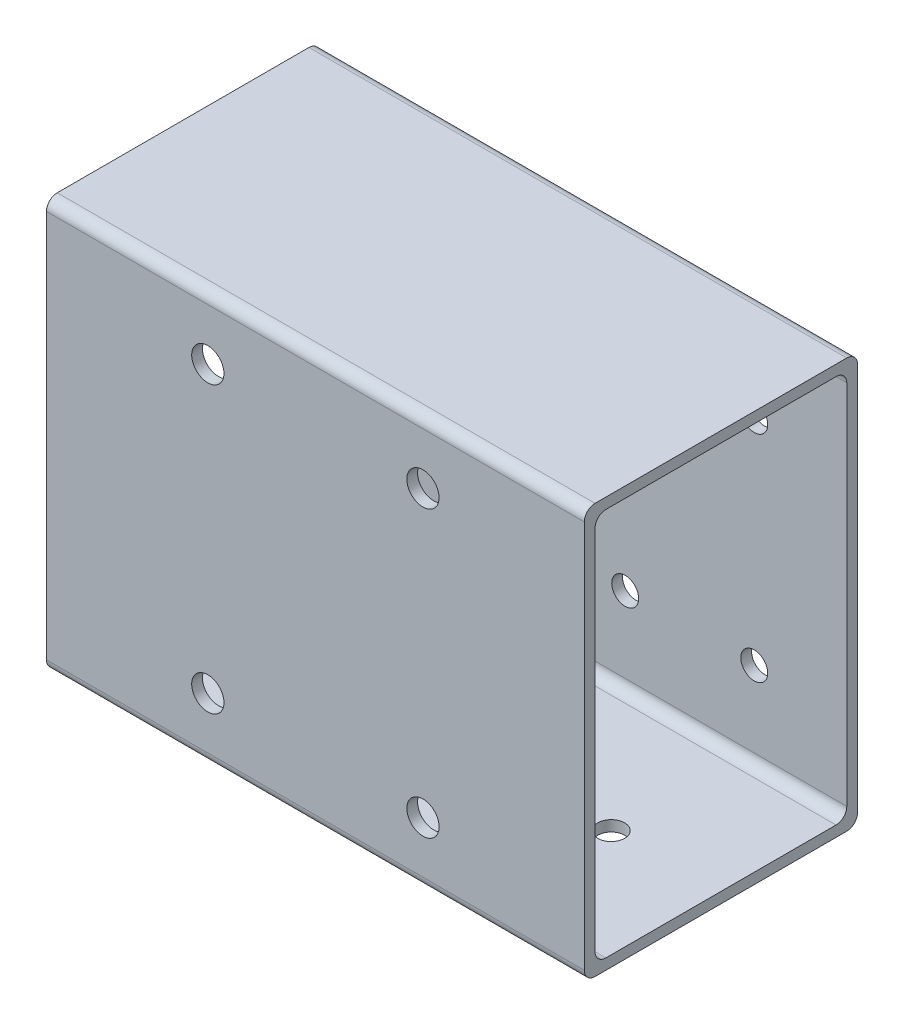
ISO-10303-21;
HEADER;
FILE_DESCRIPTION(('STEP AP214'),'2;1');
FILE_NAME('part.step','',(''),(''),'','','');
FILE_SCHEMA(('AUTOMOTIVE_DESIGN { 1 0 10303 214 1 1 1 1 }'));
ENDSEC;
DATA;
#1=APPLICATION_CONTEXT('core data for automotive mechanical design processes');
#2=APPLICATION_PROTOCOL_DEFINITION('international standard','automotive_design',2000,#1);
#3=PRODUCT_CONTEXT('',#1,'mechanical');
#4=PRODUCT('Part','Part','',(#3));
#5=PRODUCT_RELATED_PRODUCT_CATEGORY('part','',(#4));
#6=PRODUCT_DEFINITION_FORMATION('','',#4);
#7=PRODUCT_DEFINITION_CONTEXT('part definition',#1,'design');
#8=PRODUCT_DEFINITION('design','',#6,#7);
#9=PRODUCT_DEFINITION_SHAPE('','',#8);
#10=(LENGTH_UNIT() NAMED_UNIT(*) SI_UNIT(.MILLI.,.METRE.));
#11=(NAMED_UNIT(*) PLANE_ANGLE_UNIT() SI_UNIT($,.RADIAN.));
#12=(NAMED_UNIT(*) SI_UNIT($,.STERADIAN.) SOLID_ANGLE_UNIT());
#13=UNCERTAINTY_MEASURE_WITH_UNIT(LENGTH_MEASURE(1.E-05),#10,'distance_accuracy_value','');
#14=(GEOMETRIC_REPRESENTATION_CONTEXT(3) GLOBAL_UNCERTAINTY_ASSIGNED_CONTEXT((#13)) GLOBAL_UNIT_ASSIGNED_CONTEXT((#10,
#11,#12)) REPRESENTATION_CONTEXT('',''));
#15=CARTESIAN_POINT('',(0.,0.,0.));
#16=DIRECTION('',(0.,0.,1.));
#17=DIRECTION('',(1.,0.,0.));
#18=AXIS2_PLACEMENT_3D('',#15,#16,#17);
#19=CARTESIAN_POINT('',(-100.,38.1,25.4));
#20=DIRECTION('',(0.,0.,1.));
#21=DIRECTION('',(0.,-1.,0.));
#22=AXIS2_PLACEMENT_3D('',#19,#20,#21);
#23=PLANE('',#22);
#24=CARTESIAN_POINT('',(-30.,-26.5,25.4));
#25=DIRECTION('',(0.,0.,1.));
#26=DIRECTION('',(1.,0.,0.));
#27=AXIS2_PLACEMENT_3D('',#24,#25,#26);
#28=CIRCLE('',#27,3.);
#29=CARTESIAN_POINT('',(-27.,-26.5,25.4));
#30=VERTEX_POINT('',#29);
#31=EDGE_CURVE('E324',#30,#30,#28,.T.);
#32=ORIENTED_EDGE('',*,*,#31,.F.);
#33=EDGE_LOOP('',(#32));
#34=FACE_BOUND('',#33,.T.);
#35=CARTESIAN_POINT('',(-70.,-26.5,25.4));
#36=DIRECTION('',(0.,0.,1.));
#37=DIRECTION('',(1.,0.,0.));
#38=AXIS2_PLACEMENT_3D('',#35,#36,#37);
#39=CIRCLE('',#38,3.00000000000001);
#40=CARTESIAN_POINT('',(-67.,-26.5,25.4));
#41=VERTEX_POINT('',#40);
#42=EDGE_CURVE('E397',#41,#41,#39,.T.);
#43=ORIENTED_EDGE('',*,*,#42,.F.);
#44=EDGE_LOOP('',(#43));
#45=FACE_BOUND('',#44,.T.);
#46=CARTESIAN_POINT('',(-70.,26.5,25.4));
#47=DIRECTION('',(0.,0.,1.));
#48=DIRECTION('',(1.,0.,0.));
#49=AXIS2_PLACEMENT_3D('',#46,#47,#48);
#50=CIRCLE('',#49,3.00000000000001);
#51=CARTESIAN_POINT('',(-67.,26.5,25.4));
#52=VERTEX_POINT('',#51);
#53=EDGE_CURVE('E393',#52,#52,#50,.T.);
#54=ORIENTED_EDGE('',*,*,#53,.F.);
#55=EDGE_LOOP('',(#54));
#56=FACE_BOUND('',#55,.T.);
#57=CARTESIAN_POINT('',(-30.,26.5,25.4));
#58=DIRECTION('',(0.,0.,1.));
#59=DIRECTION('',(1.,0.,0.));
#60=AXIS2_PLACEMENT_3D('',#57,#58,#59);
#61=CIRCLE('',#60,3.);
#62=CARTESIAN_POINT('',(-27.,26.5,25.4));
#63=VERTEX_POINT('',#62);
#64=EDGE_CURVE('E290',#63,#63,#61,.T.);
#65=ORIENTED_EDGE('',*,*,#64,.F.);
#66=EDGE_LOOP('',(#65));
#67=FACE_BOUND('',#66,.T.);
#68=DIRECTION('',(0.,-1.,0.));
#69=VECTOR('',#68,1.);
#70=CARTESIAN_POINT('',(-100.,38.1,25.4));
#71=LINE('',#70,#69);
#72=CARTESIAN_POINT('',(-100.,36.1,25.4));
#73=VERTEX_POINT('',#72);
#74=CARTESIAN_POINT('',(-100.,-36.0999999999999,25.4));
#75=VERTEX_POINT('',#74);
#76=EDGE_CURVE('E438',#73,#75,#71,.T.);
#77=ORIENTED_EDGE('',*,*,#76,.T.);
#78=DIRECTION('',(1.,0.,0.));
#79=VECTOR('',#78,1.);
#80=CARTESIAN_POINT('',(-100.,-36.1,25.4));
#81=LINE('',#80,#79);
#82=CARTESIAN_POINT('',(0.,-36.0999999999999,25.4));
#83=VERTEX_POINT('',#82);
#84=EDGE_CURVE('E228',#75,#83,#81,.T.);
#85=ORIENTED_EDGE('',*,*,#84,.T.);
#86=DIRECTION('',(0.,-1.,0.));
#87=VECTOR('',#86,1.);
#88=CARTESIAN_POINT('',(0.,38.1,25.4));
#89=LINE('',#88,#87);
#90=CARTESIAN_POINT('',(0.,36.1,25.4));
#91=VERTEX_POINT('',#90);
#92=EDGE_CURVE('E166',#91,#83,#89,.T.);
#93=ORIENTED_EDGE('',*,*,#92,.F.);
#94=DIRECTION('',(1.,0.,0.));
#95=VECTOR('',#94,1.);
#96=CARTESIAN_POINT('',(-100.,36.1,25.4));
#97=LINE('',#96,#95);
#98=EDGE_CURVE('E225',#91,#73,#97,.F.);
#99=ORIENTED_EDGE('',*,*,#98,.T.);
#100=EDGE_LOOP('',(#77,#85,#93,#99));
#101=FACE_BOUND('',#100,.T.);
#102=ADVANCED_FACE('F44',(#34,#45,#56,#67,#101),#23,.T.);
#103=CARTESIAN_POINT('',(-100.,38.1,-25.4));
#104=DIRECTION('',(0.,1.,0.));
#105=DIRECTION('',(0.,0.,1.));
#106=AXIS2_PLACEMENT_3D('',#103,#104,#105);
#107=PLANE('',#106);
#108=DIRECTION('',(0.,0.,1.));
#109=VECTOR('',#108,1.);
#110=CARTESIAN_POINT('',(-100.,38.1,-25.4));
#111=LINE('',#110,#109);
#112=CARTESIAN_POINT('',(-100.,38.1,-23.4));
#113=VERTEX_POINT('',#112);
#114=CARTESIAN_POINT('',(-100.,38.1,23.4));
#115=VERTEX_POINT('',#114);
#116=EDGE_CURVE('E190',#113,#115,#111,.T.);
#117=ORIENTED_EDGE('',*,*,#116,.T.);
#118=DIRECTION('',(1.,0.,0.));
#119=VECTOR('',#118,1.);
#120=CARTESIAN_POINT('',(-100.,38.1,23.4));
#121=LINE('',#120,#119);
#122=CARTESIAN_POINT('',(0.,38.1,23.4));
#123=VERTEX_POINT('',#122);
#124=EDGE_CURVE('E233',#115,#123,#121,.T.);
#125=ORIENTED_EDGE('',*,*,#124,.T.);
#126=DIRECTION('',(0.,0.,1.));
#127=VECTOR('',#126,1.);
#128=CARTESIAN_POINT('',(0.,38.1,-25.4));
#129=LINE('',#128,#127);
#130=CARTESIAN_POINT('',(0.,38.1,-23.4));
#131=VERTEX_POINT('',#130);
#132=EDGE_CURVE('E199',#131,#123,#129,.T.);
#133=ORIENTED_EDGE('',*,*,#132,.F.);
#134=DIRECTION('',(1.,0.,0.));
#135=VECTOR('',#134,1.);
#136=CARTESIAN_POINT('',(-100.,38.1,-23.4));
#137=LINE('',#136,#135);
#138=EDGE_CURVE('E69',#131,#113,#137,.F.);
#139=ORIENTED_EDGE('',*,*,#138,.T.);
#140=EDGE_LOOP('',(#117,#125,#133,#139));
#141=FACE_BOUND('',#140,.T.);
#142=ADVANCED_FACE('F454',(#141),#107,.T.);
#143=CARTESIAN_POINT('',(-100.,38.1,-25.4));
#144=DIRECTION('',(0.,0.,-1.));
#145=DIRECTION('',(0.,1.,0.));
#146=AXIS2_PLACEMENT_3D('',#143,#144,#145);
#147=PLANE('',#146);
#148=CARTESIAN_POINT('',(-17.2,-20.,-25.4));
#149=DIRECTION('',(0.,0.,-1.));
#150=DIRECTION('',(0.,1.,0.));
#151=AXIS2_PLACEMENT_3D('',#148,#149,#150);
#152=CIRCLE('',#151,2.5);
#153=CARTESIAN_POINT('',(-17.2,-17.5,-25.4));
#154=VERTEX_POINT('',#153);
#155=EDGE_CURVE('E351',#154,#154,#152,.T.);
#156=ORIENTED_EDGE('',*,*,#155,.F.);
#157=EDGE_LOOP('',(#156));
#158=FACE_BOUND('',#157,.T.);
#159=CARTESIAN_POINT('',(-41.2,-20.,-25.4));
#160=DIRECTION('',(0.,0.,-1.));
#161=DIRECTION('',(0.,1.,0.));
#162=AXIS2_PLACEMENT_3D('',#159,#160,#161);
#163=CIRCLE('',#162,2.5);
#164=CARTESIAN_POINT('',(-41.2,-17.5,-25.4));
#165=VERTEX_POINT('',#164);
#166=EDGE_CURVE('E365',#165,#165,#163,.T.);
#167=ORIENTED_EDGE('',*,*,#166,.F.);
#168=EDGE_LOOP('',(#167));
#169=FACE_BOUND('',#168,.T.);
#170=CARTESIAN_POINT('',(-41.2,20.,-25.4));
#171=DIRECTION('',(0.,0.,-1.));
#172=DIRECTION('',(0.,1.,0.));
#173=AXIS2_PLACEMENT_3D('',#170,#171,#172);
#174=CIRCLE('',#173,2.5);
#175=CARTESIAN_POINT('',(-41.2,22.5,-25.4));
#176=VERTEX_POINT('',#175);
#177=EDGE_CURVE('E361',#176,#176,#174,.T.);
#178=ORIENTED_EDGE('',*,*,#177,.F.);
#179=EDGE_LOOP('',(#178));
#180=FACE_BOUND('',#179,.T.);
#181=CARTESIAN_POINT('',(-17.2,20.,-25.4));
#182=DIRECTION('',(0.,0.,-1.));
#183=DIRECTION('',(0.,1.,0.));
#184=AXIS2_PLACEMENT_3D('',#181,#182,#183);
#185=CIRCLE('',#184,2.5);
#186=CARTESIAN_POINT('',(-17.2,22.5,-25.4));
#187=VERTEX_POINT('',#186);
#188=EDGE_CURVE('E330',#187,#187,#185,.T.);
#189=ORIENTED_EDGE('',*,*,#188,.F.);
#190=EDGE_LOOP('',(#189));
#191=FACE_BOUND('',#190,.T.);
#192=CARTESIAN_POINT('',(-74.6,0.,-25.4));
#193=DIRECTION('',(0.,0.,-1.));
#194=DIRECTION('',(0.,1.,0.));
#195=AXIS2_PLACEMENT_3D('',#192,#193,#194);
#196=CIRCLE('',#195,2.5);
#197=CARTESIAN_POINT('',(-74.6,2.49999999999999,-25.4));
#198=VERTEX_POINT('',#197);
#199=EDGE_CURVE('E341',#198,#198,#196,.T.);
#200=ORIENTED_EDGE('',*,*,#199,.F.);
#201=EDGE_LOOP('',(#200));
#202=FACE_BOUND('',#201,.T.);
#203=CARTESIAN_POINT('',(-90.,-23.1,-25.4));
#204=DIRECTION('',(0.,0.,-1.));
#205=DIRECTION('',(0.,1.,0.));
#206=AXIS2_PLACEMENT_3D('',#203,#204,#205);
#207=CIRCLE('',#206,2.50000000000001);
#208=CARTESIAN_POINT('',(-90.,-20.6,-25.4));
#209=VERTEX_POINT('',#208);
#210=EDGE_CURVE('E383',#209,#209,#207,.T.);
#211=ORIENTED_EDGE('',*,*,#210,.F.);
#212=EDGE_LOOP('',(#211));
#213=FACE_BOUND('',#212,.T.);
#214=CARTESIAN_POINT('',(-59.2,-23.1,-25.4));
#215=DIRECTION('',(0.,0.,-1.));
#216=DIRECTION('',(0.,1.,0.));
#217=AXIS2_PLACEMENT_3D('',#214,#215,#216);
#218=CIRCLE('',#217,2.5);
#219=CARTESIAN_POINT('',(-59.2,-20.6,-25.4));
#220=VERTEX_POINT('',#219);
#221=EDGE_CURVE('E379',#220,#220,#218,.T.);
#222=ORIENTED_EDGE('',*,*,#221,.F.);
#223=EDGE_LOOP('',(#222));
#224=FACE_BOUND('',#223,.T.);
#225=CARTESIAN_POINT('',(-59.2,23.1,-25.4));
#226=DIRECTION('',(0.,0.,-1.));
#227=DIRECTION('',(0.,1.,0.));
#228=AXIS2_PLACEMENT_3D('',#225,#226,#227);
#229=CIRCLE('',#228,2.5);
#230=CARTESIAN_POINT('',(-59.2,25.6,-25.4));
#231=VERTEX_POINT('',#230);
#232=EDGE_CURVE('E375',#231,#231,#229,.T.);
#233=ORIENTED_EDGE('',*,*,#232,.F.);
#234=EDGE_LOOP('',(#233));
#235=FACE_BOUND('',#234,.T.);
#236=CARTESIAN_POINT('',(-90.,23.1,-25.4));
#237=DIRECTION('',(0.,0.,-1.));
#238=DIRECTION('',(0.,1.,0.));
#239=AXIS2_PLACEMENT_3D('',#236,#237,#238);
#240=CIRCLE('',#239,2.5);
#241=CARTESIAN_POINT('',(-90.,25.6,-25.4));
#242=VERTEX_POINT('',#241);
#243=EDGE_CURVE('E308',#242,#242,#240,.T.);
#244=ORIENTED_EDGE('',*,*,#243,.F.);
#245=EDGE_LOOP('',(#244));
#246=FACE_BOUND('',#245,.T.);
#247=DIRECTION('',(0.,1.,0.));
#248=VECTOR('',#247,1.);
#249=CARTESIAN_POINT('',(0.,38.1,-25.4));
#250=LINE('',#249,#248);
#251=CARTESIAN_POINT('',(0.,-36.0999999999999,-25.4));
#252=VERTEX_POINT('',#251);
#253=CARTESIAN_POINT('',(0.,36.1,-25.4));
#254=VERTEX_POINT('',#253);
#255=EDGE_CURVE('E184',#252,#254,#250,.T.);
#256=ORIENTED_EDGE('',*,*,#255,.F.);
#257=DIRECTION('',(1.,0.,0.));
#258=VECTOR('',#257,1.);
#259=CARTESIAN_POINT('',(-100.,-36.1,-25.4));
#260=LINE('',#259,#258);
#261=CARTESIAN_POINT('',(-100.,-36.0999999999999,-25.4));
#262=VERTEX_POINT('',#261);
#263=EDGE_CURVE('E212',#252,#262,#260,.F.);
#264=ORIENTED_EDGE('',*,*,#263,.T.);
#265=DIRECTION('',(0.,1.,0.));
#266=VECTOR('',#265,1.);
#267=CARTESIAN_POINT('',(-100.,38.1,-25.4));
#268=LINE('',#267,#266);
#269=CARTESIAN_POINT('',(-100.,36.1,-25.4));
#270=VERTEX_POINT('',#269);
#271=EDGE_CURVE('E196',#262,#270,#268,.T.);
#272=ORIENTED_EDGE('',*,*,#271,.T.);
#273=DIRECTION('',(1.,0.,0.));
#274=VECTOR('',#273,1.);
#275=CARTESIAN_POINT('',(-100.,36.1,-25.4));
#276=LINE('',#275,#274);
#277=EDGE_CURVE('E208',#270,#254,#276,.T.);
#278=ORIENTED_EDGE('',*,*,#277,.T.);
#279=EDGE_LOOP('',(#256,#264,#272,#278));
#280=FACE_BOUND('',#279,.T.);
#281=ADVANCED_FACE('F464',(#158,#169,#180,#191,#202,#213,#224,#235,#246,#280),#147,.T.);
#282=CARTESIAN_POINT('',(-100.,-38.1,-25.4));
#283=DIRECTION('',(0.,-1.,0.));
#284=DIRECTION('',(0.,0.,-1.));
#285=AXIS2_PLACEMENT_3D('',#282,#283,#284);
#286=PLANE('',#285);
#287=CARTESIAN_POINT('',(-20.,-38.1,0.399999999999993));
#288=DIRECTION('',(0.,-1.,0.));
#289=DIRECTION('',(0.,0.,-1.));
#290=AXIS2_PLACEMENT_3D('',#287,#288,#289);
#291=CIRCLE('',#290,2.5);
#292=CARTESIAN_POINT('',(-20.,-38.1,-2.10000000000001));
#293=VERTEX_POINT('',#292);
#294=EDGE_CURVE('E345',#293,#293,#291,.T.);
#295=ORIENTED_EDGE('',*,*,#294,.F.);
#296=EDGE_LOOP('',(#295));
#297=FACE_BOUND('',#296,.T.);
#298=CARTESIAN_POINT('',(-80.,-38.1,0.399999999999986));
#299=DIRECTION('',(0.,-1.,0.));
#300=DIRECTION('',(0.,0.,-1.));
#301=AXIS2_PLACEMENT_3D('',#298,#299,#300);
#302=CIRCLE('',#301,2.50000000000001);
#303=CARTESIAN_POINT('',(-80.,-38.1,-2.10000000000002));
#304=VERTEX_POINT('',#303);
#305=EDGE_CURVE('E353',#304,#304,#302,.T.);
#306=ORIENTED_EDGE('',*,*,#305,.F.);
#307=EDGE_LOOP('',(#306));
#308=FACE_BOUND('',#307,.T.);
#309=DIRECTION('',(0.,0.,-1.));
#310=VECTOR('',#309,1.);
#311=CARTESIAN_POINT('',(-100.,-38.1,-25.4));
#312=LINE('',#311,#310);
#313=CARTESIAN_POINT('',(-100.,-38.1,23.4));
#314=VERTEX_POINT('',#313);
#315=CARTESIAN_POINT('',(-100.,-38.1,-23.4));
#316=VERTEX_POINT('',#315);
#317=EDGE_CURVE('E442',#314,#316,#312,.T.);
#318=ORIENTED_EDGE('',*,*,#317,.T.);
#319=DIRECTION('',(1.,0.,0.));
#320=VECTOR('',#319,1.);
#321=CARTESIAN_POINT('',(-100.,-38.1,-23.4));
#322=LINE('',#321,#320);
#323=CARTESIAN_POINT('',(0.,-38.1,-23.4));
#324=VERTEX_POINT('',#323);
#325=EDGE_CURVE('E182',#316,#324,#322,.T.);
#326=ORIENTED_EDGE('',*,*,#325,.T.);
#327=DIRECTION('',(0.,0.,-1.));
#328=VECTOR('',#327,1.);
#329=CARTESIAN_POINT('',(0.,-38.1,-25.4));
#330=LINE('',#329,#328);
#331=CARTESIAN_POINT('',(0.,-38.1,23.4));
#332=VERTEX_POINT('',#331);
#333=EDGE_CURVE('E164',#332,#324,#330,.T.);
#334=ORIENTED_EDGE('',*,*,#333,.F.);
#335=DIRECTION('',(1.,0.,0.));
#336=VECTOR('',#335,1.);
#337=CARTESIAN_POINT('',(-100.,-38.1,23.4));
#338=LINE('',#337,#336);
#339=EDGE_CURVE('E179',#332,#314,#338,.F.);
#340=ORIENTED_EDGE('',*,*,#339,.T.);
#341=EDGE_LOOP('',(#318,#326,#334,#340));
#342=FACE_BOUND('',#341,.T.);
#343=ADVANCED_FACE('F178',(#297,#308,#342),#286,.T.);
#344=CARTESIAN_POINT('',(-100.,0.,0.));
#345=DIRECTION('',(-1.,0.,0.));
#346=DIRECTION('',(0.,0.,1.));
#347=AXIS2_PLACEMENT_3D('',#344,#345,#346);
#348=PLANE('',#347);
#349=DIRECTION('',(0.,0.,1.));
#350=VECTOR('',#349,1.);
#351=CARTESIAN_POINT('',(-100.,36.1,-23.4));
#352=LINE('',#351,#350);
#353=CARTESIAN_POINT('',(-100.,36.1,-21.4));
#354=VERTEX_POINT('',#353);
#355=CARTESIAN_POINT('',(-100.,36.1,21.4));
#356=VERTEX_POINT('',#355);
#357=EDGE_CURVE('E420',#354,#356,#352,.T.);
#358=ORIENTED_EDGE('',*,*,#357,.T.);
#359=CARTESIAN_POINT('',(-100.,34.1,21.4));
#360=DIRECTION('',(-1.,0.,0.));
#361=DIRECTION('',(0.,0.,1.));
#362=AXIS2_PLACEMENT_3D('',#359,#360,#361);
#363=CIRCLE('',#362,2.);
#364=CARTESIAN_POINT('',(-100.,34.1,23.4));
#365=VERTEX_POINT('',#364);
#366=EDGE_CURVE('E11',#356,#365,#363,.F.);
#367=ORIENTED_EDGE('',*,*,#366,.T.);
#368=DIRECTION('',(0.,-1.,0.));
#369=VECTOR('',#368,1.);
#370=CARTESIAN_POINT('',(-100.,36.1,23.4));
#371=LINE('',#370,#369);
#372=CARTESIAN_POINT('',(-100.,-34.1,23.4));
#373=VERTEX_POINT('',#372);
#374=EDGE_CURVE('E407',#365,#373,#371,.T.);
#375=ORIENTED_EDGE('',*,*,#374,.T.);
#376=CARTESIAN_POINT('',(-100.,-34.1,21.4));
#377=DIRECTION('',(-1.,0.,0.));
#378=DIRECTION('',(0.,0.,1.));
#379=AXIS2_PLACEMENT_3D('',#376,#377,#378);
#380=CIRCLE('',#379,2.);
#381=CARTESIAN_POINT('',(-100.,-36.1,21.4));
#382=VERTEX_POINT('',#381);
#383=EDGE_CURVE('E280',#373,#382,#380,.F.);
#384=ORIENTED_EDGE('',*,*,#383,.T.);
#385=DIRECTION('',(0.,0.,-1.));
#386=VECTOR('',#385,1.);
#387=CARTESIAN_POINT('',(-100.,-36.1,-23.4));
#388=LINE('',#387,#386);
#389=CARTESIAN_POINT('',(-100.,-36.1,-21.4));
#390=VERTEX_POINT('',#389);
#391=EDGE_CURVE('E411',#382,#390,#388,.T.);
#392=ORIENTED_EDGE('',*,*,#391,.T.);
#393=CARTESIAN_POINT('',(-100.,-34.1,-21.4));
#394=DIRECTION('',(-1.,0.,0.));
#395=DIRECTION('',(0.,0.,1.));
#396=AXIS2_PLACEMENT_3D('',#393,#394,#395);
#397=CIRCLE('',#396,2.);
#398=CARTESIAN_POINT('',(-100.,-34.1,-23.4));
#399=VERTEX_POINT('',#398);
#400=EDGE_CURVE('E268',#390,#399,#397,.F.);
#401=ORIENTED_EDGE('',*,*,#400,.T.);
#402=DIRECTION('',(0.,1.,0.));
#403=VECTOR('',#402,1.);
#404=CARTESIAN_POINT('',(-100.,36.1,-23.4));
#405=LINE('',#404,#403);
#406=CARTESIAN_POINT('',(-100.,34.1,-23.4));
#407=VERTEX_POINT('',#406);
#408=EDGE_CURVE('E416',#399,#407,#405,.T.);
#409=ORIENTED_EDGE('',*,*,#408,.T.);
#410=CARTESIAN_POINT('',(-100.,34.1,-21.4));
#411=DIRECTION('',(-1.,0.,0.));
#412=DIRECTION('',(0.,0.,1.));
#413=AXIS2_PLACEMENT_3D('',#410,#411,#412);
#414=CIRCLE('',#413,2.);
#415=EDGE_CURVE('E274',#407,#354,#414,.F.);
#416=ORIENTED_EDGE('',*,*,#415,.T.);
#417=EDGE_LOOP('',(#358,#367,#375,#384,#392,#401,#409,#416));
#418=FACE_BOUND('',#417,.T.);
#419=ORIENTED_EDGE('',*,*,#271,.F.);
#420=CARTESIAN_POINT('',(-100.,-36.1,-23.4));
#421=DIRECTION('',(-1.,0.,0.));
#422=DIRECTION('',(0.,0.,1.));
#423=AXIS2_PLACEMENT_3D('',#420,#421,#422);
#424=CIRCLE('',#423,2.);
#425=EDGE_CURVE('E222',#262,#316,#424,.T.);
#426=ORIENTED_EDGE('',*,*,#425,.T.);
#427=ORIENTED_EDGE('',*,*,#317,.F.);
#428=CARTESIAN_POINT('',(-100.,-36.1,23.4));
#429=DIRECTION('',(-1.,0.,0.));
#430=DIRECTION('',(0.,0.,1.));
#431=AXIS2_PLACEMENT_3D('',#428,#429,#430);
#432=CIRCLE('',#431,2.);
#433=EDGE_CURVE('E188',#314,#75,#432,.T.);
#434=ORIENTED_EDGE('',*,*,#433,.T.);
#435=ORIENTED_EDGE('',*,*,#76,.F.);
#436=CARTESIAN_POINT('',(-100.,36.1,23.4));
#437=DIRECTION('',(-1.,0.,0.));
#438=DIRECTION('',(0.,0.,1.));
#439=AXIS2_PLACEMENT_3D('',#436,#437,#438);
#440=CIRCLE('',#439,2.);
#441=EDGE_CURVE('E62',#73,#115,#440,.T.);
#442=ORIENTED_EDGE('',*,*,#441,.T.);
#443=ORIENTED_EDGE('',*,*,#116,.F.);
#444=CARTESIAN_POINT('',(-100.,36.1,-23.4));
#445=DIRECTION('',(-1.,0.,0.));
#446=DIRECTION('',(0.,0.,1.));
#447=AXIS2_PLACEMENT_3D('',#444,#445,#446);
#448=CIRCLE('',#447,2.);
#449=EDGE_CURVE('E215',#113,#270,#448,.T.);
#450=ORIENTED_EDGE('',*,*,#449,.T.);
#451=EDGE_LOOP('',(#419,#426,#427,#434,#435,#442,#443,#450));
#452=FACE_BOUND('',#451,.T.);
#453=ADVANCED_FACE('F461',(#418,#452),#348,.T.);
#454=CARTESIAN_POINT('',(0.,0.,0.));
#455=DIRECTION('',(-1.,0.,0.));
#456=DIRECTION('',(0.,0.,1.));
#457=AXIS2_PLACEMENT_3D('',#454,#455,#456);
#458=PLANE('',#457);
#459=DIRECTION('',(0.,0.,-1.));
#460=VECTOR('',#459,1.);
#461=CARTESIAN_POINT('',(0.,-36.1,-23.4));
#462=LINE('',#461,#460);
#463=CARTESIAN_POINT('',(0.,-36.1,21.4));
#464=VERTEX_POINT('',#463);
#465=CARTESIAN_POINT('',(0.,-36.1,-21.4));
#466=VERTEX_POINT('',#465);
#467=EDGE_CURVE('E427',#464,#466,#462,.T.);
#468=ORIENTED_EDGE('',*,*,#467,.F.);
#469=CARTESIAN_POINT('',(0.,-34.1,21.4));
#470=DIRECTION('',(-1.,0.,0.));
#471=DIRECTION('',(0.,0.,1.));
#472=AXIS2_PLACEMENT_3D('',#469,#470,#471);
#473=CIRCLE('',#472,2.);
#474=CARTESIAN_POINT('',(0.,-34.1,23.4));
#475=VERTEX_POINT('',#474);
#476=EDGE_CURVE('E277',#464,#475,#473,.T.);
#477=ORIENTED_EDGE('',*,*,#476,.T.);
#478=DIRECTION('',(0.,-1.,0.));
#479=VECTOR('',#478,1.);
#480=CARTESIAN_POINT('',(0.,36.1,23.4));
#481=LINE('',#480,#479);
#482=CARTESIAN_POINT('',(0.,34.1,23.4));
#483=VERTEX_POINT('',#482);
#484=EDGE_CURVE('E302',#483,#475,#481,.T.);
#485=ORIENTED_EDGE('',*,*,#484,.F.);
#486=CARTESIAN_POINT('',(0.,34.1,21.4));
#487=DIRECTION('',(-1.,0.,0.));
#488=DIRECTION('',(0.,0.,1.));
#489=AXIS2_PLACEMENT_3D('',#486,#487,#488);
#490=CIRCLE('',#489,2.);
#491=CARTESIAN_POINT('',(0.,36.1,21.4));
#492=VERTEX_POINT('',#491);
#493=EDGE_CURVE('E54',#483,#492,#490,.T.);
#494=ORIENTED_EDGE('',*,*,#493,.T.);
#495=DIRECTION('',(0.,0.,1.));
#496=VECTOR('',#495,1.);
#497=CARTESIAN_POINT('',(0.,36.1,-23.4));
#498=LINE('',#497,#496);
#499=CARTESIAN_POINT('',(0.,36.1,-21.4));
#500=VERTEX_POINT('',#499);
#501=EDGE_CURVE('E412',#500,#492,#498,.T.);
#502=ORIENTED_EDGE('',*,*,#501,.F.);
#503=CARTESIAN_POINT('',(0.,34.1,-21.4));
#504=DIRECTION('',(-1.,0.,0.));
#505=DIRECTION('',(0.,0.,1.));
#506=AXIS2_PLACEMENT_3D('',#503,#504,#505);
#507=CIRCLE('',#506,2.);
#508=CARTESIAN_POINT('',(0.,34.1,-23.4));
#509=VERTEX_POINT('',#508);
#510=EDGE_CURVE('E271',#500,#509,#507,.T.);
#511=ORIENTED_EDGE('',*,*,#510,.T.);
#512=DIRECTION('',(0.,1.,0.));
#513=VECTOR('',#512,1.);
#514=CARTESIAN_POINT('',(0.,36.1,-23.4));
#515=LINE('',#514,#513);
#516=CARTESIAN_POINT('',(0.,-34.1,-23.4));
#517=VERTEX_POINT('',#516);
#518=EDGE_CURVE('E431',#517,#509,#515,.T.);
#519=ORIENTED_EDGE('',*,*,#518,.F.);
#520=CARTESIAN_POINT('',(0.,-34.1,-21.4));
#521=DIRECTION('',(-1.,0.,0.));
#522=DIRECTION('',(0.,0.,1.));
#523=AXIS2_PLACEMENT_3D('',#520,#521,#522);
#524=CIRCLE('',#523,2.);
#525=EDGE_CURVE('E265',#517,#466,#524,.T.);
#526=ORIENTED_EDGE('',*,*,#525,.T.);
#527=EDGE_LOOP('',(#468,#477,#485,#494,#502,#511,#519,#526));
#528=FACE_BOUND('',#527,.T.);
#529=ORIENTED_EDGE('',*,*,#333,.T.);
#530=CARTESIAN_POINT('',(0.,-36.1,-23.4));
#531=DIRECTION('',(-1.,0.,0.));
#532=DIRECTION('',(0.,0.,1.));
#533=AXIS2_PLACEMENT_3D('',#530,#531,#532);
#534=CIRCLE('',#533,2.);
#535=EDGE_CURVE('E172',#324,#252,#534,.F.);
#536=ORIENTED_EDGE('',*,*,#535,.T.);
#537=ORIENTED_EDGE('',*,*,#255,.T.);
#538=CARTESIAN_POINT('',(0.,36.1,-23.4));
#539=DIRECTION('',(-1.,0.,0.));
#540=DIRECTION('',(0.,0.,1.));
#541=AXIS2_PLACEMENT_3D('',#538,#539,#540);
#542=CIRCLE('',#541,2.);
#543=EDGE_CURVE('E194',#254,#131,#542,.F.);
#544=ORIENTED_EDGE('',*,*,#543,.T.);
#545=ORIENTED_EDGE('',*,*,#132,.T.);
#546=CARTESIAN_POINT('',(0.,36.1,23.4));
#547=DIRECTION('',(-1.,0.,0.));
#548=DIRECTION('',(0.,0.,1.));
#549=AXIS2_PLACEMENT_3D('',#546,#547,#548);
#550=CIRCLE('',#549,2.);
#551=EDGE_CURVE('E173',#123,#91,#550,.F.);
#552=ORIENTED_EDGE('',*,*,#551,.T.);
#553=ORIENTED_EDGE('',*,*,#92,.T.);
#554=CARTESIAN_POINT('',(0.,-36.1,23.4));
#555=DIRECTION('',(-1.,0.,0.));
#556=DIRECTION('',(0.,0.,1.));
#557=AXIS2_PLACEMENT_3D('',#554,#555,#556);
#558=CIRCLE('',#557,2.);
#559=EDGE_CURVE('E161',#83,#332,#558,.F.);
#560=ORIENTED_EDGE('',*,*,#559,.T.);
#561=EDGE_LOOP('',(#529,#536,#537,#544,#545,#552,#553,#560));
#562=FACE_BOUND('',#561,.T.);
#563=ADVANCED_FACE('F163',(#528,#562),#458,.F.);
#564=CARTESIAN_POINT('',(-100.,36.1,23.4));
#565=DIRECTION('',(0.,0.,1.));
#566=DIRECTION('',(1.,0.,0.));
#567=AXIS2_PLACEMENT_3D('',#564,#565,#566);
#568=PLANE('',#567);
#569=CARTESIAN_POINT('',(-30.,-26.5,23.4));
#570=DIRECTION('',(0.,0.,1.));
#571=DIRECTION('',(1.,0.,0.));
#572=AXIS2_PLACEMENT_3D('',#569,#570,#571);
#573=CIRCLE('',#572,3.);
#574=CARTESIAN_POINT('',(-27.,-26.5,23.4));
#575=VERTEX_POINT('',#574);
#576=EDGE_CURVE('E298',#575,#575,#573,.T.);
#577=ORIENTED_EDGE('',*,*,#576,.T.);
#578=EDGE_LOOP('',(#577));
#579=FACE_BOUND('',#578,.T.);
#580=CARTESIAN_POINT('',(-70.,-26.5,23.4));
#581=DIRECTION('',(0.,0.,1.));
#582=DIRECTION('',(1.,0.,0.));
#583=AXIS2_PLACEMENT_3D('',#580,#581,#582);
#584=CIRCLE('',#583,3.00000000000001);
#585=CARTESIAN_POINT('',(-67.,-26.5,23.4));
#586=VERTEX_POINT('',#585);
#587=EDGE_CURVE('E294',#586,#586,#584,.T.);
#588=ORIENTED_EDGE('',*,*,#587,.T.);
#589=EDGE_LOOP('',(#588));
#590=FACE_BOUND('',#589,.T.);
#591=CARTESIAN_POINT('',(-70.,26.5,23.4));
#592=DIRECTION('',(0.,0.,1.));
#593=DIRECTION('',(1.,0.,0.));
#594=AXIS2_PLACEMENT_3D('',#591,#592,#593);
#595=CIRCLE('',#594,3.00000000000001);
#596=CARTESIAN_POINT('',(-67.,26.5,23.4));
#597=VERTEX_POINT('',#596);
#598=EDGE_CURVE('E289',#597,#597,#595,.T.);
#599=ORIENTED_EDGE('',*,*,#598,.T.);
#600=EDGE_LOOP('',(#599));
#601=FACE_BOUND('',#600,.T.);
#602=CARTESIAN_POINT('',(-30.,26.5,23.4));
#603=DIRECTION('',(0.,0.,1.));
#604=DIRECTION('',(1.,0.,0.));
#605=AXIS2_PLACEMENT_3D('',#602,#603,#604);
#606=CIRCLE('',#605,3.);
#607=CARTESIAN_POINT('',(-27.,26.5,23.4));
#608=VERTEX_POINT('',#607);
#609=EDGE_CURVE('E285',#608,#608,#606,.T.);
#610=ORIENTED_EDGE('',*,*,#609,.T.);
#611=EDGE_LOOP('',(#610));
#612=FACE_BOUND('',#611,.T.);
#613=ORIENTED_EDGE('',*,*,#484,.T.);
#614=DIRECTION('',(1.,0.,0.));
#615=VECTOR('',#614,1.);
#616=CARTESIAN_POINT('',(-100.,-34.1,23.4));
#617=LINE('',#616,#615);
#618=EDGE_CURVE('E262',#475,#373,#617,.F.);
#619=ORIENTED_EDGE('',*,*,#618,.T.);
#620=ORIENTED_EDGE('',*,*,#374,.F.);
#621=DIRECTION('',(1.,0.,0.));
#622=VECTOR('',#621,1.);
#623=CARTESIAN_POINT('',(0.,34.1,23.4));
#624=LINE('',#623,#622);
#625=EDGE_CURVE('E258',#365,#483,#624,.T.);
#626=ORIENTED_EDGE('',*,*,#625,.T.);
#627=EDGE_LOOP('',(#613,#619,#620,#626));
#628=FACE_BOUND('',#627,.T.);
#629=ADVANCED_FACE('F509',(#579,#590,#601,#612,#628),#568,.F.);
#630=CARTESIAN_POINT('',(-100.,36.1,-23.4));
#631=DIRECTION('',(0.,1.,0.));
#632=DIRECTION('',(0.,0.,1.));
#633=AXIS2_PLACEMENT_3D('',#630,#631,#632);
#634=PLANE('',#633);
#635=ORIENTED_EDGE('',*,*,#357,.F.);
#636=DIRECTION('',(1.,0.,0.));
#637=VECTOR('',#636,1.);
#638=CARTESIAN_POINT('',(0.,36.1,-21.4));
#639=LINE('',#638,#637);
#640=EDGE_CURVE('E254',#354,#500,#639,.T.);
#641=ORIENTED_EDGE('',*,*,#640,.T.);
#642=ORIENTED_EDGE('',*,*,#501,.T.);
#643=DIRECTION('',(1.,0.,0.));
#644=VECTOR('',#643,1.);
#645=CARTESIAN_POINT('',(-100.,36.1,21.4));
#646=LINE('',#645,#644);
#647=EDGE_CURVE('E251',#492,#356,#646,.F.);
#648=ORIENTED_EDGE('',*,*,#647,.T.);
#649=EDGE_LOOP('',(#635,#641,#642,#648));
#650=FACE_BOUND('',#649,.T.);
#651=ADVANCED_FACE('F504',(#650),#634,.F.);
#652=CARTESIAN_POINT('',(-100.,36.1,-23.4));
#653=DIRECTION('',(0.,0.,-1.));
#654=DIRECTION('',(-1.,0.,0.));
#655=AXIS2_PLACEMENT_3D('',#652,#653,#654);
#656=PLANE('',#655);
#657=CARTESIAN_POINT('',(-17.2,-20.,-23.4));
#658=DIRECTION('',(0.,0.,-1.));
#659=DIRECTION('',(-1.,0.,0.));
#660=AXIS2_PLACEMENT_3D('',#657,#658,#659);
#661=CIRCLE('',#660,2.5);
#662=CARTESIAN_POINT('',(-19.7,-20.,-23.4));
#663=VERTEX_POINT('',#662);
#664=EDGE_CURVE('E338',#663,#663,#661,.T.);
#665=ORIENTED_EDGE('',*,*,#664,.T.);
#666=EDGE_LOOP('',(#665));
#667=FACE_BOUND('',#666,.T.);
#668=CARTESIAN_POINT('',(-41.2,-20.,-23.4));
#669=DIRECTION('',(0.,0.,-1.));
#670=DIRECTION('',(-1.,0.,0.));
#671=AXIS2_PLACEMENT_3D('',#668,#669,#670);
#672=CIRCLE('',#671,2.5);
#673=CARTESIAN_POINT('',(-43.7,-20.,-23.4));
#674=VERTEX_POINT('',#673);
#675=EDGE_CURVE('E334',#674,#674,#672,.T.);
#676=ORIENTED_EDGE('',*,*,#675,.T.);
#677=EDGE_LOOP('',(#676));
#678=FACE_BOUND('',#677,.T.);
#679=CARTESIAN_POINT('',(-41.2,20.,-23.4));
#680=DIRECTION('',(0.,0.,-1.));
#681=DIRECTION('',(-1.,0.,0.));
#682=AXIS2_PLACEMENT_3D('',#679,#680,#681);
#683=CIRCLE('',#682,2.5);
#684=CARTESIAN_POINT('',(-43.7,20.,-23.4));
#685=VERTEX_POINT('',#684);
#686=EDGE_CURVE('E329',#685,#685,#683,.T.);
#687=ORIENTED_EDGE('',*,*,#686,.T.);
#688=EDGE_LOOP('',(#687));
#689=FACE_BOUND('',#688,.T.);
#690=CARTESIAN_POINT('',(-17.2,20.,-23.4));
#691=DIRECTION('',(0.,0.,-1.));
#692=DIRECTION('',(-1.,0.,0.));
#693=AXIS2_PLACEMENT_3D('',#690,#691,#692);
#694=CIRCLE('',#693,2.5);
#695=CARTESIAN_POINT('',(-19.7,20.,-23.4));
#696=VERTEX_POINT('',#695);
#697=EDGE_CURVE('E325',#696,#696,#694,.T.);
#698=ORIENTED_EDGE('',*,*,#697,.T.);
#699=EDGE_LOOP('',(#698));
#700=FACE_BOUND('',#699,.T.);
#701=CARTESIAN_POINT('',(-74.6,0.,-23.4));
#702=DIRECTION('',(0.,0.,-1.));
#703=DIRECTION('',(-1.,0.,0.));
#704=AXIS2_PLACEMENT_3D('',#701,#702,#703);
#705=CIRCLE('',#704,2.5);
#706=CARTESIAN_POINT('',(-77.1,0.,-23.4));
#707=VERTEX_POINT('',#706);
#708=EDGE_CURVE('E320',#707,#707,#705,.T.);
#709=ORIENTED_EDGE('',*,*,#708,.T.);
#710=EDGE_LOOP('',(#709));
#711=FACE_BOUND('',#710,.T.);
#712=CARTESIAN_POINT('',(-90.,-23.1,-23.4));
#713=DIRECTION('',(0.,0.,-1.));
#714=DIRECTION('',(-1.,0.,0.));
#715=AXIS2_PLACEMENT_3D('',#712,#713,#714);
#716=CIRCLE('',#715,2.50000000000001);
#717=CARTESIAN_POINT('',(-92.5,-23.1,-23.4));
#718=VERTEX_POINT('',#717);
#719=EDGE_CURVE('E316',#718,#718,#716,.T.);
#720=ORIENTED_EDGE('',*,*,#719,.T.);
#721=EDGE_LOOP('',(#720));
#722=FACE_BOUND('',#721,.T.);
#723=CARTESIAN_POINT('',(-59.2,-23.1,-23.4));
#724=DIRECTION('',(0.,0.,-1.));
#725=DIRECTION('',(-1.,0.,0.));
#726=AXIS2_PLACEMENT_3D('',#723,#724,#725);
#727=CIRCLE('',#726,2.5);
#728=CARTESIAN_POINT('',(-61.7,-23.1,-23.4));
#729=VERTEX_POINT('',#728);
#730=EDGE_CURVE('E312',#729,#729,#727,.T.);
#731=ORIENTED_EDGE('',*,*,#730,.T.);
#732=EDGE_LOOP('',(#731));
#733=FACE_BOUND('',#732,.T.);
#734=CARTESIAN_POINT('',(-59.2,23.1,-23.4));
#735=DIRECTION('',(0.,0.,-1.));
#736=DIRECTION('',(-1.,0.,0.));
#737=AXIS2_PLACEMENT_3D('',#734,#735,#736);
#738=CIRCLE('',#737,2.5);
#739=CARTESIAN_POINT('',(-61.7,23.1,-23.4));
#740=VERTEX_POINT('',#739);
#741=EDGE_CURVE('E307',#740,#740,#738,.T.);
#742=ORIENTED_EDGE('',*,*,#741,.T.);
#743=EDGE_LOOP('',(#742));
#744=FACE_BOUND('',#743,.T.);
#745=CARTESIAN_POINT('',(-90.,23.1,-23.4));
#746=DIRECTION('',(0.,0.,-1.));
#747=DIRECTION('',(-1.,0.,0.));
#748=AXIS2_PLACEMENT_3D('',#745,#746,#747);
#749=CIRCLE('',#748,2.5);
#750=CARTESIAN_POINT('',(-92.5,23.1,-23.4));
#751=VERTEX_POINT('',#750);
#752=EDGE_CURVE('E303',#751,#751,#749,.T.);
#753=ORIENTED_EDGE('',*,*,#752,.T.);
#754=EDGE_LOOP('',(#753));
#755=FACE_BOUND('',#754,.T.);
#756=ORIENTED_EDGE('',*,*,#408,.F.);
#757=DIRECTION('',(1.,0.,0.));
#758=VECTOR('',#757,1.);
#759=CARTESIAN_POINT('',(0.,-34.1,-23.4));
#760=LINE('',#759,#758);
#761=EDGE_CURVE('E240',#399,#517,#760,.T.);
#762=ORIENTED_EDGE('',*,*,#761,.T.);
#763=ORIENTED_EDGE('',*,*,#518,.T.);
#764=DIRECTION('',(1.,0.,0.));
#765=VECTOR('',#764,1.);
#766=CARTESIAN_POINT('',(-100.,34.1,-23.4));
#767=LINE('',#766,#765);
#768=EDGE_CURVE('E237',#509,#407,#767,.F.);
#769=ORIENTED_EDGE('',*,*,#768,.T.);
#770=EDGE_LOOP('',(#756,#762,#763,#769));
#771=FACE_BOUND('',#770,.T.);
#772=ADVANCED_FACE('F498',(#667,#678,#689,#700,#711,#722,#733,#744,#755,#771),#656,.F.);
#773=CARTESIAN_POINT('',(-100.,-36.1,-23.4));
#774=DIRECTION('',(0.,-1.,0.));
#775=DIRECTION('',(0.,0.,-1.));
#776=AXIS2_PLACEMENT_3D('',#773,#774,#775);
#777=PLANE('',#776);
#778=CARTESIAN_POINT('',(-20.,-36.1,0.399999999999994));
#779=DIRECTION('',(0.,-1.,0.));
#780=DIRECTION('',(0.,0.,-1.));
#781=AXIS2_PLACEMENT_3D('',#778,#779,#780);
#782=CIRCLE('',#781,2.5);
#783=CARTESIAN_POINT('',(-20.,-36.1,-2.1));
#784=VERTEX_POINT('',#783);
#785=EDGE_CURVE('E48',#784,#784,#782,.T.);
#786=ORIENTED_EDGE('',*,*,#785,.T.);
#787=EDGE_LOOP('',(#786));
#788=FACE_BOUND('',#787,.T.);
#789=CARTESIAN_POINT('',(-80.,-36.1,0.399999999999986));
#790=DIRECTION('',(0.,-1.,0.));
#791=DIRECTION('',(0.,0.,-1.));
#792=AXIS2_PLACEMENT_3D('',#789,#790,#791);
#793=CIRCLE('',#792,2.50000000000001);
#794=CARTESIAN_POINT('',(-80.,-36.1,-2.10000000000002));
#795=VERTEX_POINT('',#794);
#796=EDGE_CURVE('E342',#795,#795,#793,.T.);
#797=ORIENTED_EDGE('',*,*,#796,.T.);
#798=EDGE_LOOP('',(#797));
#799=FACE_BOUND('',#798,.T.);
#800=ORIENTED_EDGE('',*,*,#467,.T.);
#801=DIRECTION('',(1.,0.,0.));
#802=VECTOR('',#801,1.);
#803=CARTESIAN_POINT('',(-100.,-36.1,-21.4));
#804=LINE('',#803,#802);
#805=EDGE_CURVE('E248',#466,#390,#804,.F.);
#806=ORIENTED_EDGE('',*,*,#805,.T.);
#807=ORIENTED_EDGE('',*,*,#391,.F.);
#808=DIRECTION('',(1.,0.,0.));
#809=VECTOR('',#808,1.);
#810=CARTESIAN_POINT('',(0.,-36.1,21.4));
#811=LINE('',#810,#809);
#812=EDGE_CURVE('E244',#382,#464,#811,.T.);
#813=ORIENTED_EDGE('',*,*,#812,.T.);
#814=EDGE_LOOP('',(#800,#806,#807,#813));
#815=FACE_BOUND('',#814,.T.);
#816=ADVANCED_FACE('F494',(#788,#799,#815),#777,.F.);
#817=CARTESIAN_POINT('',(-100.,-36.1,-23.4));
#818=DIRECTION('',(1.,0.,0.));
#819=DIRECTION('',(0.,0.,-1.));
#820=AXIS2_PLACEMENT_3D('',#817,#818,#819);
#821=CYLINDRICAL_SURFACE('',#820,2.);
#822=ORIENTED_EDGE('',*,*,#425,.F.);
#823=ORIENTED_EDGE('',*,*,#263,.F.);
#824=ORIENTED_EDGE('',*,*,#535,.F.);
#825=ORIENTED_EDGE('',*,*,#325,.F.);
#826=EDGE_LOOP('',(#822,#823,#824,#825));
#827=FACE_BOUND('',#826,.T.);
#828=ADVANCED_FACE('F467',(#827),#821,.T.);
#829=CARTESIAN_POINT('',(-100.,-36.1,23.4));
#830=DIRECTION('',(1.,0.,0.));
#831=DIRECTION('',(0.,0.,-1.));
#832=AXIS2_PLACEMENT_3D('',#829,#830,#831);
#833=CYLINDRICAL_SURFACE('',#832,2.);
#834=ORIENTED_EDGE('',*,*,#433,.F.);
#835=ORIENTED_EDGE('',*,*,#339,.F.);
#836=ORIENTED_EDGE('',*,*,#559,.F.);
#837=ORIENTED_EDGE('',*,*,#84,.F.);
#838=EDGE_LOOP('',(#834,#835,#836,#837));
#839=FACE_BOUND('',#838,.T.);
#840=ADVANCED_FACE('F187',(#839),#833,.T.);
#841=CARTESIAN_POINT('',(-100.,36.1,23.4));
#842=DIRECTION('',(1.,0.,0.));
#843=DIRECTION('',(0.,0.,-1.));
#844=AXIS2_PLACEMENT_3D('',#841,#842,#843);
#845=CYLINDRICAL_SURFACE('',#844,2.);
#846=ORIENTED_EDGE('',*,*,#441,.F.);
#847=ORIENTED_EDGE('',*,*,#98,.F.);
#848=ORIENTED_EDGE('',*,*,#551,.F.);
#849=ORIENTED_EDGE('',*,*,#124,.F.);
#850=EDGE_LOOP('',(#846,#847,#848,#849));
#851=FACE_BOUND('',#850,.T.);
#852=ADVANCED_FACE('F471',(#851),#845,.T.);
#853=CARTESIAN_POINT('',(-100.,36.1,-23.4));
#854=DIRECTION('',(1.,0.,0.));
#855=DIRECTION('',(0.,0.,-1.));
#856=AXIS2_PLACEMENT_3D('',#853,#854,#855);
#857=CYLINDRICAL_SURFACE('',#856,2.);
#858=ORIENTED_EDGE('',*,*,#449,.F.);
#859=ORIENTED_EDGE('',*,*,#138,.F.);
#860=ORIENTED_EDGE('',*,*,#543,.F.);
#861=ORIENTED_EDGE('',*,*,#277,.F.);
#862=EDGE_LOOP('',(#858,#859,#860,#861));
#863=FACE_BOUND('',#862,.T.);
#864=ADVANCED_FACE('F458',(#863),#857,.T.);
#865=CARTESIAN_POINT('',(-100.,-34.1,-21.4));
#866=DIRECTION('',(-1.,0.,0.));
#867=DIRECTION('',(0.,0.,1.));
#868=AXIS2_PLACEMENT_3D('',#865,#866,#867);
#869=CYLINDRICAL_SURFACE('',#868,2.);
#870=ORIENTED_EDGE('',*,*,#400,.F.);
#871=ORIENTED_EDGE('',*,*,#805,.F.);
#872=ORIENTED_EDGE('',*,*,#525,.F.);
#873=ORIENTED_EDGE('',*,*,#761,.F.);
#874=EDGE_LOOP('',(#870,#871,#872,#873));
#875=FACE_BOUND('',#874,.T.);
#876=ADVANCED_FACE('F478',(#875),#869,.F.);
#877=CARTESIAN_POINT('',(-100.,34.1,-21.4));
#878=DIRECTION('',(-1.,0.,0.));
#879=DIRECTION('',(0.,0.,1.));
#880=AXIS2_PLACEMENT_3D('',#877,#878,#879);
#881=CYLINDRICAL_SURFACE('',#880,2.);
#882=ORIENTED_EDGE('',*,*,#415,.F.);
#883=ORIENTED_EDGE('',*,*,#768,.F.);
#884=ORIENTED_EDGE('',*,*,#510,.F.);
#885=ORIENTED_EDGE('',*,*,#640,.F.);
#886=EDGE_LOOP('',(#882,#883,#884,#885));
#887=FACE_BOUND('',#886,.T.);
#888=ADVANCED_FACE('F579',(#887),#881,.F.);
#889=CARTESIAN_POINT('',(-100.,-34.1,21.4));
#890=DIRECTION('',(-1.,0.,0.));
#891=DIRECTION('',(0.,0.,1.));
#892=AXIS2_PLACEMENT_3D('',#889,#890,#891);
#893=CYLINDRICAL_SURFACE('',#892,2.);
#894=ORIENTED_EDGE('',*,*,#383,.F.);
#895=ORIENTED_EDGE('',*,*,#618,.F.);
#896=ORIENTED_EDGE('',*,*,#476,.F.);
#897=ORIENTED_EDGE('',*,*,#812,.F.);
#898=EDGE_LOOP('',(#894,#895,#896,#897));
#899=FACE_BOUND('',#898,.T.);
#900=ADVANCED_FACE('F565',(#899),#893,.F.);
#901=CARTESIAN_POINT('',(-100.,34.1,21.4));
#902=DIRECTION('',(-1.,0.,0.));
#903=DIRECTION('',(0.,0.,1.));
#904=AXIS2_PLACEMENT_3D('',#901,#902,#903);
#905=CYLINDRICAL_SURFACE('',#904,2.);
#906=ORIENTED_EDGE('',*,*,#366,.F.);
#907=ORIENTED_EDGE('',*,*,#647,.F.);
#908=ORIENTED_EDGE('',*,*,#493,.F.);
#909=ORIENTED_EDGE('',*,*,#625,.F.);
#910=EDGE_LOOP('',(#906,#907,#908,#909));
#911=FACE_BOUND('',#910,.T.);
#912=ADVANCED_FACE('F46',(#911),#905,.F.);
#913=CARTESIAN_POINT('',(-30.,26.5,15.4));
#914=DIRECTION('',(0.,0.,1.));
#915=DIRECTION('',(1.,0.,0.));
#916=AXIS2_PLACEMENT_3D('',#913,#914,#915);
#917=CYLINDRICAL_SURFACE('',#916,3.);
#918=ORIENTED_EDGE('',*,*,#64,.T.);
#919=EDGE_LOOP('',(#918));
#920=FACE_BOUND('',#919,.T.);
#921=ORIENTED_EDGE('',*,*,#609,.F.);
#922=EDGE_LOOP('',(#921));
#923=FACE_BOUND('',#922,.T.);
#924=ADVANCED_FACE('F805',(#920,#923),#917,.F.);
#925=CARTESIAN_POINT('',(-70.,26.5,15.4));
#926=DIRECTION('',(0.,0.,1.));
#927=DIRECTION('',(1.,0.,0.));
#928=AXIS2_PLACEMENT_3D('',#925,#926,#927);
#929=CYLINDRICAL_SURFACE('',#928,3.00000000000001);
#930=ORIENTED_EDGE('',*,*,#53,.T.);
#931=EDGE_LOOP('',(#930));
#932=FACE_BOUND('',#931,.T.);
#933=ORIENTED_EDGE('',*,*,#598,.F.);
#934=EDGE_LOOP('',(#933));
#935=FACE_BOUND('',#934,.T.);
#936=ADVANCED_FACE('F795',(#932,#935),#929,.F.);
#937=CARTESIAN_POINT('',(-70.,-26.5,15.4));
#938=DIRECTION('',(0.,0.,1.));
#939=DIRECTION('',(1.,0.,0.));
#940=AXIS2_PLACEMENT_3D('',#937,#938,#939);
#941=CYLINDRICAL_SURFACE('',#940,3.00000000000001);
#942=ORIENTED_EDGE('',*,*,#42,.T.);
#943=EDGE_LOOP('',(#942));
#944=FACE_BOUND('',#943,.T.);
#945=ORIENTED_EDGE('',*,*,#587,.F.);
#946=EDGE_LOOP('',(#945));
#947=FACE_BOUND('',#946,.T.);
#948=ADVANCED_FACE('F785',(#944,#947),#941,.F.);
#949=CARTESIAN_POINT('',(-30.,-26.5,15.4));
#950=DIRECTION('',(0.,0.,1.));
#951=DIRECTION('',(1.,0.,0.));
#952=AXIS2_PLACEMENT_3D('',#949,#950,#951);
#953=CYLINDRICAL_SURFACE('',#952,3.);
#954=ORIENTED_EDGE('',*,*,#31,.T.);
#955=EDGE_LOOP('',(#954));
#956=FACE_BOUND('',#955,.T.);
#957=ORIENTED_EDGE('',*,*,#576,.F.);
#958=EDGE_LOOP('',(#957));
#959=FACE_BOUND('',#958,.T.);
#960=ADVANCED_FACE('F546',(#956,#959),#953,.F.);
#961=CARTESIAN_POINT('',(-90.,23.1,-15.4));
#962=DIRECTION('',(0.,0.,-1.));
#963=DIRECTION('',(0.,1.,0.));
#964=AXIS2_PLACEMENT_3D('',#961,#962,#963);
#965=CYLINDRICAL_SURFACE('',#964,2.5);
#966=ORIENTED_EDGE('',*,*,#243,.T.);
#967=EDGE_LOOP('',(#966));
#968=FACE_BOUND('',#967,.T.);
#969=ORIENTED_EDGE('',*,*,#752,.F.);
#970=EDGE_LOOP('',(#969));
#971=FACE_BOUND('',#970,.T.);
#972=ADVANCED_FACE('F542',(#968,#971),#965,.F.);
#973=CARTESIAN_POINT('',(-59.2,23.1,-15.4));
#974=DIRECTION('',(0.,0.,-1.));
#975=DIRECTION('',(0.,1.,0.));
#976=AXIS2_PLACEMENT_3D('',#973,#974,#975);
#977=CYLINDRICAL_SURFACE('',#976,2.5);
#978=ORIENTED_EDGE('',*,*,#232,.T.);
#979=EDGE_LOOP('',(#978));
#980=FACE_BOUND('',#979,.T.);
#981=ORIENTED_EDGE('',*,*,#741,.F.);
#982=EDGE_LOOP('',(#981));
#983=FACE_BOUND('',#982,.T.);
#984=ADVANCED_FACE('F545',(#980,#983),#977,.F.);
#985=CARTESIAN_POINT('',(-59.2,-23.1,-15.4));
#986=DIRECTION('',(0.,0.,-1.));
#987=DIRECTION('',(0.,1.,0.));
#988=AXIS2_PLACEMENT_3D('',#985,#986,#987);
#989=CYLINDRICAL_SURFACE('',#988,2.5);
#990=ORIENTED_EDGE('',*,*,#221,.T.);
#991=EDGE_LOOP('',(#990));
#992=FACE_BOUND('',#991,.T.);
#993=ORIENTED_EDGE('',*,*,#730,.F.);
#994=EDGE_LOOP('',(#993));
#995=FACE_BOUND('',#994,.T.);
#996=ADVANCED_FACE('F751',(#992,#995),#989,.F.);
#997=CARTESIAN_POINT('',(-90.,-23.1,-15.4));
#998=DIRECTION('',(0.,0.,-1.));
#999=DIRECTION('',(0.,1.,0.));
#1000=AXIS2_PLACEMENT_3D('',#997,#998,#999);
#1001=CYLINDRICAL_SURFACE('',#1000,2.50000000000001);
#1002=ORIENTED_EDGE('',*,*,#210,.T.);
#1003=EDGE_LOOP('',(#1002));
#1004=FACE_BOUND('',#1003,.T.);
#1005=ORIENTED_EDGE('',*,*,#719,.F.);
#1006=EDGE_LOOP('',(#1005));
#1007=FACE_BOUND('',#1006,.T.);
#1008=ADVANCED_FACE('F742',(#1004,#1007),#1001,.F.);
#1009=CARTESIAN_POINT('',(-74.6,0.,-15.4));
#1010=DIRECTION('',(0.,0.,-1.));
#1011=DIRECTION('',(0.,1.,0.));
#1012=AXIS2_PLACEMENT_3D('',#1009,#1010,#1011);
#1013=CYLINDRICAL_SURFACE('',#1012,2.5);
#1014=ORIENTED_EDGE('',*,*,#199,.T.);
#1015=EDGE_LOOP('',(#1014));
#1016=FACE_BOUND('',#1015,.T.);
#1017=ORIENTED_EDGE('',*,*,#708,.F.);
#1018=EDGE_LOOP('',(#1017));
#1019=FACE_BOUND('',#1018,.T.);
#1020=ADVANCED_FACE('F732',(#1016,#1019),#1013,.F.);
#1021=CARTESIAN_POINT('',(-17.2,20.,-15.4));
#1022=DIRECTION('',(0.,0.,-1.));
#1023=DIRECTION('',(0.,1.,0.));
#1024=AXIS2_PLACEMENT_3D('',#1021,#1022,#1023);
#1025=CYLINDRICAL_SURFACE('',#1024,2.5);
#1026=ORIENTED_EDGE('',*,*,#188,.T.);
#1027=EDGE_LOOP('',(#1026));
#1028=FACE_BOUND('',#1027,.T.);
#1029=ORIENTED_EDGE('',*,*,#697,.F.);
#1030=EDGE_LOOP('',(#1029));
#1031=FACE_BOUND('',#1030,.T.);
#1032=ADVANCED_FACE('F722',(#1028,#1031),#1025,.F.);
#1033=CARTESIAN_POINT('',(-41.2,20.,-15.4));
#1034=DIRECTION('',(0.,0.,-1.));
#1035=DIRECTION('',(0.,1.,0.));
#1036=AXIS2_PLACEMENT_3D('',#1033,#1034,#1035);
#1037=CYLINDRICAL_SURFACE('',#1036,2.5);
#1038=ORIENTED_EDGE('',*,*,#177,.T.);
#1039=EDGE_LOOP('',(#1038));
#1040=FACE_BOUND('',#1039,.T.);
#1041=ORIENTED_EDGE('',*,*,#686,.F.);
#1042=EDGE_LOOP('',(#1041));
#1043=FACE_BOUND('',#1042,.T.);
#1044=ADVANCED_FACE('F713',(#1040,#1043),#1037,.F.);
#1045=CARTESIAN_POINT('',(-41.2,-20.,-15.4));
#1046=DIRECTION('',(0.,0.,-1.));
#1047=DIRECTION('',(0.,1.,0.));
#1048=AXIS2_PLACEMENT_3D('',#1045,#1046,#1047);
#1049=CYLINDRICAL_SURFACE('',#1048,2.5);
#1050=ORIENTED_EDGE('',*,*,#166,.T.);
#1051=EDGE_LOOP('',(#1050));
#1052=FACE_BOUND('',#1051,.T.);
#1053=ORIENTED_EDGE('',*,*,#675,.F.);
#1054=EDGE_LOOP('',(#1053));
#1055=FACE_BOUND('',#1054,.T.);
#1056=ADVANCED_FACE('F704',(#1052,#1055),#1049,.F.);
#1057=CARTESIAN_POINT('',(-17.2,-20.,-15.4));
#1058=DIRECTION('',(0.,0.,-1.));
#1059=DIRECTION('',(0.,1.,0.));
#1060=AXIS2_PLACEMENT_3D('',#1057,#1058,#1059);
#1061=CYLINDRICAL_SURFACE('',#1060,2.5);
#1062=ORIENTED_EDGE('',*,*,#155,.T.);
#1063=EDGE_LOOP('',(#1062));
#1064=FACE_BOUND('',#1063,.T.);
#1065=ORIENTED_EDGE('',*,*,#664,.F.);
#1066=EDGE_LOOP('',(#1065));
#1067=FACE_BOUND('',#1066,.T.);
#1068=ADVANCED_FACE('F669',(#1064,#1067),#1061,.F.);
#1069=CARTESIAN_POINT('',(-80.,-28.1,0.399999999999987));
#1070=DIRECTION('',(0.,-1.,0.));
#1071=DIRECTION('',(0.,0.,-1.));
#1072=AXIS2_PLACEMENT_3D('',#1069,#1070,#1071);
#1073=CYLINDRICAL_SURFACE('',#1072,2.50000000000001);
#1074=ORIENTED_EDGE('',*,*,#305,.T.);
#1075=EDGE_LOOP('',(#1074));
#1076=FACE_BOUND('',#1075,.T.);
#1077=ORIENTED_EDGE('',*,*,#796,.F.);
#1078=EDGE_LOOP('',(#1077));
#1079=FACE_BOUND('',#1078,.T.);
#1080=ADVANCED_FACE('F679',(#1076,#1079),#1073,.F.);
#1081=CARTESIAN_POINT('',(-20.,-28.1,0.399999999999995));
#1082=DIRECTION('',(0.,-1.,0.));
#1083=DIRECTION('',(0.,0.,-1.));
#1084=AXIS2_PLACEMENT_3D('',#1081,#1082,#1083);
#1085=CYLINDRICAL_SURFACE('',#1084,2.5);
#1086=ORIENTED_EDGE('',*,*,#294,.T.);
#1087=EDGE_LOOP('',(#1086));
#1088=FACE_BOUND('',#1087,.T.);
#1089=ORIENTED_EDGE('',*,*,#785,.F.);
#1090=EDGE_LOOP('',(#1089));
#1091=FACE_BOUND('',#1090,.T.);
#1092=ADVANCED_FACE('F684',(#1088,#1091),#1085,.F.);
#1093=CLOSED_SHELL('',(#102,#142,#281,#343,#453,#563,#629,#651,#772,#816,#828,#840,#852,#864,
#876,#888,#900,#912,#924,#936,#948,#960,#972,#984,#996,#1008,#1020,#1032,#1044,#1056,#1068,
#1080,#1092));
#1094=MANIFOLD_SOLID_BREP('B2',#1093);
#1095=ADVANCED_BREP_SHAPE_REPRESENTATION('',(#18,#1094),#14);
#1096=SHAPE_DEFINITION_REPRESENTATION(#9,#1095);
ENDSEC;
END-ISO-10303-21;
